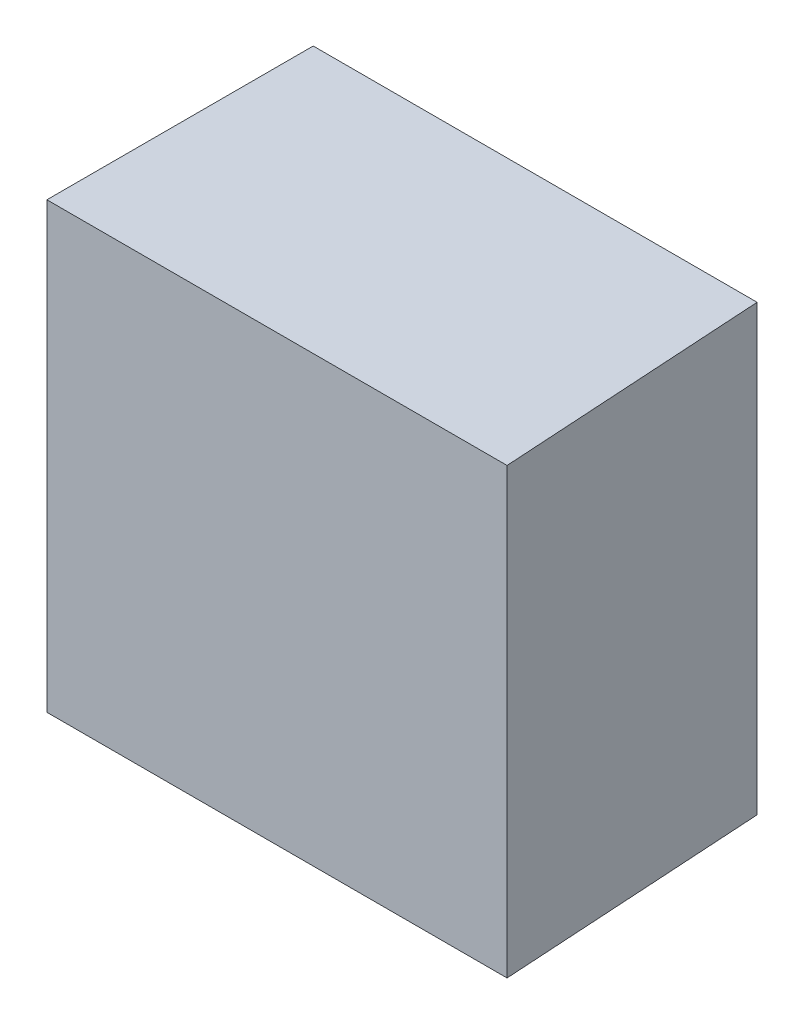
ISO-10303-21;
HEADER;
FILE_DESCRIPTION(('STEP AP214'),'2;1');
FILE_NAME('part.step','',(''),(''),'','','');
FILE_SCHEMA(('AUTOMOTIVE_DESIGN { 1 0 10303 214 1 1 1 1 }'));
ENDSEC;
DATA;
#1=APPLICATION_CONTEXT('core data for automotive mechanical design processes');
#2=APPLICATION_PROTOCOL_DEFINITION('international standard','automotive_design',2000,#1);
#3=PRODUCT_CONTEXT('',#1,'mechanical');
#4=PRODUCT('Part','Part','',(#3));
#5=PRODUCT_RELATED_PRODUCT_CATEGORY('part','',(#4));
#6=PRODUCT_DEFINITION_FORMATION('','',#4);
#7=PRODUCT_DEFINITION_CONTEXT('part definition',#1,'design');
#8=PRODUCT_DEFINITION('design','',#6,#7);
#9=PRODUCT_DEFINITION_SHAPE('','',#8);
#10=(LENGTH_UNIT() NAMED_UNIT(*) SI_UNIT(.MILLI.,.METRE.));
#11=(NAMED_UNIT(*) PLANE_ANGLE_UNIT() SI_UNIT($,.RADIAN.));
#12=(NAMED_UNIT(*) SI_UNIT($,.STERADIAN.) SOLID_ANGLE_UNIT());
#13=UNCERTAINTY_MEASURE_WITH_UNIT(LENGTH_MEASURE(1.E-05),#10,'distance_accuracy_value','');
#14=(GEOMETRIC_REPRESENTATION_CONTEXT(3) GLOBAL_UNCERTAINTY_ASSIGNED_CONTEXT((#13)) GLOBAL_UNIT_ASSIGNED_CONTEXT((#10,
#11,#12)) REPRESENTATION_CONTEXT('',''));
#15=CARTESIAN_POINT('',(0.,0.,0.));
#16=DIRECTION('',(0.,0.,1.));
#17=DIRECTION('',(1.,0.,0.));
#18=AXIS2_PLACEMENT_3D('',#15,#16,#17);
#19=CARTESIAN_POINT('',(-0.8,0.6,0.));
#20=DIRECTION('',(0.,0.,1.));
#21=DIRECTION('',(1.,0.,0.));
#22=AXIS2_PLACEMENT_3D('',#19,#20,#21);
#23=PLANE('',#22);
#24=DIRECTION('',(-1.,0.,0.));
#25=VECTOR('',#24,1.);
#26=CARTESIAN_POINT('',(-0.8,0.6,0.));
#27=LINE('',#26,#25);
#28=CARTESIAN_POINT('',(-0.6,0.6,0.));
#29=VERTEX_POINT('',#28);
#30=CARTESIAN_POINT('',(-0.8,0.6,0.));
#31=VERTEX_POINT('',#30);
#32=EDGE_CURVE('E11',#29,#31,#27,.T.);
#33=ORIENTED_EDGE('',*,*,#32,.F.);
#34=DIRECTION('',(0.,1.,0.));
#35=VECTOR('',#34,1.);
#36=CARTESIAN_POINT('',(-0.6,-0.8,0.));
#37=LINE('',#36,#35);
#38=CARTESIAN_POINT('',(-0.6,0.4,0.));
#39=VERTEX_POINT('',#38);
#40=EDGE_CURVE('E24',#39,#29,#37,.T.);
#41=ORIENTED_EDGE('',*,*,#40,.F.);
#42=DIRECTION('',(-1.,0.,0.));
#43=VECTOR('',#42,1.);
#44=CARTESIAN_POINT('',(-0.8,0.4,0.));
#45=LINE('',#44,#43);
#46=CARTESIAN_POINT('',(-0.8,0.4,0.));
#47=VERTEX_POINT('',#46);
#48=EDGE_CURVE('E85',#39,#47,#45,.T.);
#49=ORIENTED_EDGE('',*,*,#48,.T.);
#50=DIRECTION('',(0.,-1.,0.));
#51=VECTOR('',#50,1.);
#52=CARTESIAN_POINT('',(-0.8,0.6,0.));
#53=LINE('',#52,#51);
#54=EDGE_CURVE('E82',#31,#47,#53,.T.);
#55=ORIENTED_EDGE('',*,*,#54,.F.);
#56=EDGE_LOOP('',(#33,#41,#49,#55));
#57=FACE_BOUND('',#56,.T.);
#58=ADVANCED_FACE('F17',(#57),#23,.F.);
#59=CARTESIAN_POINT('',(-0.8,0.6,0.));
#60=DIRECTION('',(1.,0.,0.));
#61=DIRECTION('',(0.,0.,-1.));
#62=AXIS2_PLACEMENT_3D('',#59,#60,#61);
#63=PLANE('',#62);
#64=DIRECTION('',(0.,0.,1.));
#65=VECTOR('',#64,1.);
#66=CARTESIAN_POINT('',(-0.8,0.4,0.));
#67=LINE('',#66,#65);
#68=CARTESIAN_POINT('',(-0.8,0.4,0.12));
#69=VERTEX_POINT('',#68);
#70=EDGE_CURVE('E80',#47,#69,#67,.T.);
#71=ORIENTED_EDGE('',*,*,#70,.T.);
#72=DIRECTION('',(0.,-1.,0.));
#73=VECTOR('',#72,1.);
#74=CARTESIAN_POINT('',(-0.8,0.6,0.12));
#75=LINE('',#74,#73);
#76=CARTESIAN_POINT('',(-0.8,0.6,0.12));
#77=VERTEX_POINT('',#76);
#78=EDGE_CURVE('E78',#77,#69,#75,.T.);
#79=ORIENTED_EDGE('',*,*,#78,.F.);
#80=DIRECTION('',(0.,0.,1.));
#81=VECTOR('',#80,1.);
#82=CARTESIAN_POINT('',(-0.8,0.6,0.));
#83=LINE('',#82,#81);
#84=EDGE_CURVE('E69',#31,#77,#83,.T.);
#85=ORIENTED_EDGE('',*,*,#84,.F.);
#86=ORIENTED_EDGE('',*,*,#54,.T.);
#87=EDGE_LOOP('',(#71,#79,#85,#86));
#88=FACE_BOUND('',#87,.T.);
#89=ADVANCED_FACE('F90',(#88),#63,.F.);
#90=CARTESIAN_POINT('',(-0.8,0.6,0.12));
#91=DIRECTION('',(0.,0.,-1.));
#92=DIRECTION('',(-1.,0.,0.));
#93=AXIS2_PLACEMENT_3D('',#90,#91,#92);
#94=PLANE('',#93);
#95=DIRECTION('',(1.,0.,0.));
#96=VECTOR('',#95,1.);
#97=CARTESIAN_POINT('',(-0.8,0.4,0.12));
#98=LINE('',#97,#96);
#99=CARTESIAN_POINT('',(-0.592660485581942,0.4,0.12));
#100=VERTEX_POINT('',#99);
#101=EDGE_CURVE('E60',#69,#100,#98,.T.);
#102=ORIENTED_EDGE('',*,*,#101,.T.);
#103=DIRECTION('',(0.,1.,0.));
#104=VECTOR('',#103,1.);
#105=CARTESIAN_POINT('',(-0.592660485581942,0.6,0.12));
#106=LINE('',#105,#104);
#107=CARTESIAN_POINT('',(-0.592660485581942,0.6,0.12));
#108=VERTEX_POINT('',#107);
#109=EDGE_CURVE('E54',#100,#108,#106,.T.);
#110=ORIENTED_EDGE('',*,*,#109,.T.);
#111=DIRECTION('',(1.,0.,0.));
#112=VECTOR('',#111,1.);
#113=CARTESIAN_POINT('',(-0.8,0.6,0.12));
#114=LINE('',#113,#112);
#115=EDGE_CURVE('E58',#77,#108,#114,.T.);
#116=ORIENTED_EDGE('',*,*,#115,.F.);
#117=ORIENTED_EDGE('',*,*,#78,.T.);
#118=EDGE_LOOP('',(#102,#110,#116,#117));
#119=FACE_BOUND('',#118,.T.);
#120=ADVANCED_FACE('F56',(#119),#94,.F.);
#121=CARTESIAN_POINT('',(0.,0.6,0.));
#122=DIRECTION('',(0.,1.,0.));
#123=DIRECTION('',(0.,0.,1.));
#124=AXIS2_PLACEMENT_3D('',#121,#122,#123);
#125=PLANE('',#124);
#126=DIRECTION('',(0.061048539534857,0.,0.998134798421867));
#127=VECTOR('',#126,1.);
#128=CARTESIAN_POINT('',(-0.597763845492396,0.6,0.0365608030215443));
#129=LINE('',#128,#127);
#130=EDGE_CURVE('E67',#29,#108,#129,.T.);
#131=ORIENTED_EDGE('',*,*,#130,.F.);
#132=ORIENTED_EDGE('',*,*,#32,.T.);
#133=ORIENTED_EDGE('',*,*,#84,.T.);
#134=ORIENTED_EDGE('',*,*,#115,.T.);
#135=EDGE_LOOP('',(#131,#132,#133,#134));
#136=FACE_BOUND('',#135,.T.);
#137=ADVANCED_FACE('F66',(#136),#125,.T.);
#138=CARTESIAN_POINT('',(0.,0.4,0.));
#139=DIRECTION('',(0.,1.,0.));
#140=DIRECTION('',(0.,0.,1.));
#141=AXIS2_PLACEMENT_3D('',#138,#139,#140);
#142=PLANE('',#141);
#143=ORIENTED_EDGE('',*,*,#48,.F.);
#144=DIRECTION('',(0.061048539534857,0.,0.998134798421867));
#145=VECTOR('',#144,1.);
#146=CARTESIAN_POINT('',(-0.597763845492396,0.4,0.0365608030215443));
#147=LINE('',#146,#145);
#148=EDGE_CURVE('E72',#39,#100,#147,.T.);
#149=ORIENTED_EDGE('',*,*,#148,.T.);
#150=ORIENTED_EDGE('',*,*,#101,.F.);
#151=ORIENTED_EDGE('',*,*,#70,.F.);
#152=EDGE_LOOP('',(#143,#149,#150,#151));
#153=FACE_BOUND('',#152,.T.);
#154=ADVANCED_FACE('F91',(#153),#142,.F.);
#155=CARTESIAN_POINT('',(-0.597763845492396,-0.8,0.0365608030215443));
#156=DIRECTION('',(-0.998134798421867,0.,0.061048539534857));
#157=DIRECTION('',(0.061048539534857,0.,0.998134798421867));
#158=AXIS2_PLACEMENT_3D('',#155,#156,#157);
#159=PLANE('',#158);
#160=ORIENTED_EDGE('',*,*,#130,.T.);
#161=ORIENTED_EDGE('',*,*,#109,.F.);
#162=ORIENTED_EDGE('',*,*,#148,.F.);
#163=ORIENTED_EDGE('',*,*,#40,.T.);
#164=EDGE_LOOP('',(#160,#161,#162,#163));
#165=FACE_BOUND('',#164,.T.);
#166=ADVANCED_FACE('F71',(#165),#159,.F.);
#167=CLOSED_SHELL('',(#58,#89,#120,#137,#154,#166));
#168=MANIFOLD_SOLID_BREP('B1',#167);
#169=ADVANCED_BREP_SHAPE_REPRESENTATION('',(#18,#168),#14);
#170=SHAPE_DEFINITION_REPRESENTATION(#9,#169);
ENDSEC;
END-ISO-10303-21;
